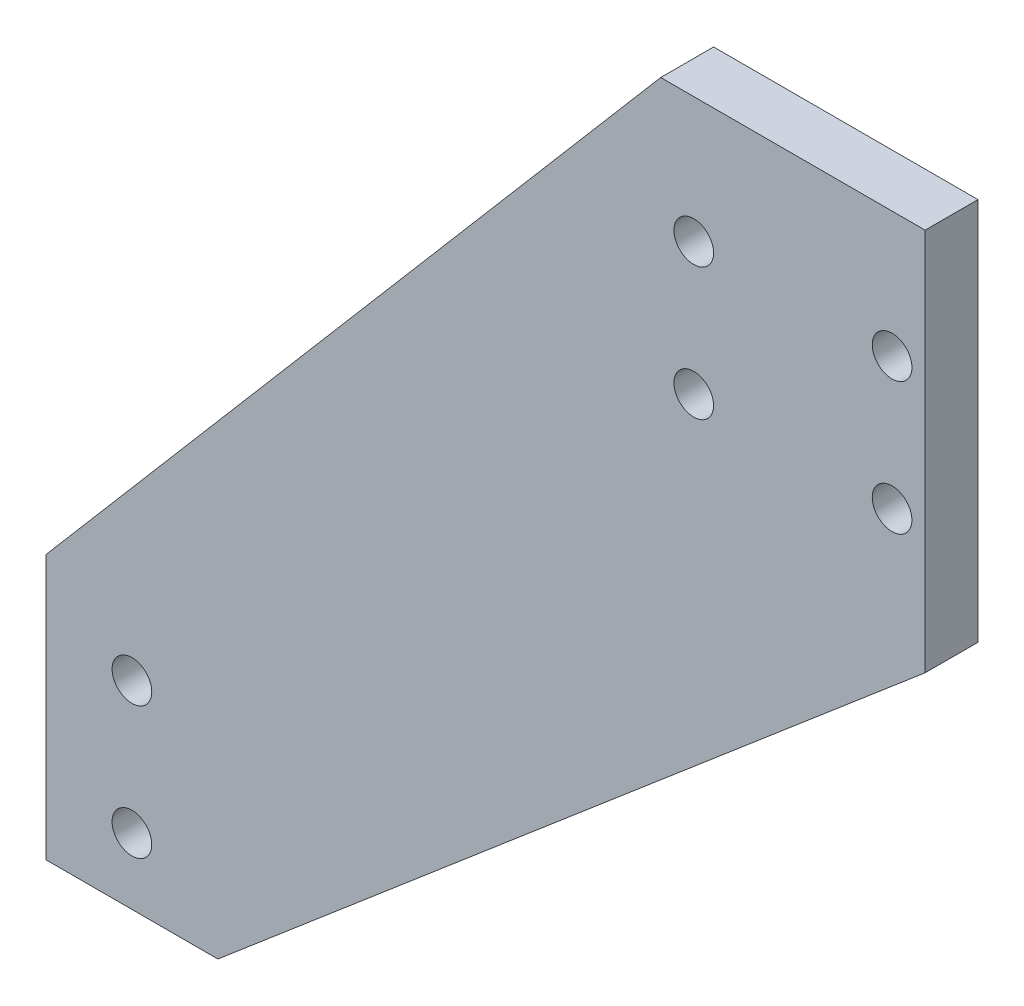
ISO-10303-21;
HEADER;
FILE_DESCRIPTION(('STEP AP214'),'2;1');
FILE_NAME('part.step','',(''),(''),'','','');
FILE_SCHEMA(('AUTOMOTIVE_DESIGN { 1 0 10303 214 1 1 1 1 }'));
ENDSEC;
DATA;
#1=APPLICATION_CONTEXT('core data for automotive mechanical design processes');
#2=APPLICATION_PROTOCOL_DEFINITION('international standard','automotive_design',2000,#1);
#3=PRODUCT_CONTEXT('',#1,'mechanical');
#4=PRODUCT('Part','Part','',(#3));
#5=PRODUCT_RELATED_PRODUCT_CATEGORY('part','',(#4));
#6=PRODUCT_DEFINITION_FORMATION('','',#4);
#7=PRODUCT_DEFINITION_CONTEXT('part definition',#1,'design');
#8=PRODUCT_DEFINITION('design','',#6,#7);
#9=PRODUCT_DEFINITION_SHAPE('','',#8);
#10=(LENGTH_UNIT() NAMED_UNIT(*) SI_UNIT(.MILLI.,.METRE.));
#11=(NAMED_UNIT(*) PLANE_ANGLE_UNIT() SI_UNIT($,.RADIAN.));
#12=(NAMED_UNIT(*) SI_UNIT($,.STERADIAN.) SOLID_ANGLE_UNIT());
#13=UNCERTAINTY_MEASURE_WITH_UNIT(LENGTH_MEASURE(1.E-05),#10,'distance_accuracy_value','');
#14=(GEOMETRIC_REPRESENTATION_CONTEXT(3) GLOBAL_UNCERTAINTY_ASSIGNED_CONTEXT((#13)) GLOBAL_UNIT_ASSIGNED_CONTEXT((#10,
#11,#12)) REPRESENTATION_CONTEXT('',''));
#15=CARTESIAN_POINT('',(0.,0.,0.));
#16=DIRECTION('',(0.,0.,1.));
#17=DIRECTION('',(1.,0.,0.));
#18=AXIS2_PLACEMENT_3D('',#15,#16,#17);
#19=CARTESIAN_POINT('',(0.,0.,4.));
#20=DIRECTION('',(0.,0.,1.));
#21=DIRECTION('',(1.,0.,0.));
#22=AXIS2_PLACEMENT_3D('',#19,#20,#21);
#23=PLANE('',#22);
#24=CARTESIAN_POINT('',(49.,65.,4.));
#25=DIRECTION('',(0.,0.,1.));
#26=DIRECTION('',(-1.,0.,0.));
#27=AXIS2_PLACEMENT_3D('',#24,#25,#26);
#28=CIRCLE('',#27,1.5);
#29=CARTESIAN_POINT('',(47.5,65.,4.));
#30=VERTEX_POINT('',#29);
#31=EDGE_CURVE('E228',#30,#30,#28,.T.);
#32=ORIENTED_EDGE('',*,*,#31,.F.);
#33=EDGE_LOOP('',(#32));
#34=FACE_BOUND('',#33,.T.);
#35=CARTESIAN_POINT('',(49.,55.,4.));
#36=DIRECTION('',(0.,0.,1.));
#37=DIRECTION('',(1.,0.,0.));
#38=AXIS2_PLACEMENT_3D('',#35,#36,#37);
#39=CIRCLE('',#38,1.5);
#40=CARTESIAN_POINT('',(50.5,55.,4.));
#41=VERTEX_POINT('',#40);
#42=EDGE_CURVE('E244',#41,#41,#39,.T.);
#43=ORIENTED_EDGE('',*,*,#42,.F.);
#44=EDGE_LOOP('',(#43));
#45=FACE_BOUND('',#44,.T.);
#46=CARTESIAN_POINT('',(6.5,15.,4.));
#47=DIRECTION('',(0.,0.,1.));
#48=DIRECTION('',(1.,0.,0.));
#49=AXIS2_PLACEMENT_3D('',#46,#47,#48);
#50=CIRCLE('',#49,1.5);
#51=CARTESIAN_POINT('',(8.,15.,4.));
#52=VERTEX_POINT('',#51);
#53=EDGE_CURVE('E142',#52,#52,#50,.T.);
#54=ORIENTED_EDGE('',*,*,#53,.F.);
#55=EDGE_LOOP('',(#54));
#56=FACE_BOUND('',#55,.T.);
#57=DIRECTION('',(0.,-1.,0.));
#58=VECTOR('',#57,1.);
#59=CARTESIAN_POINT('',(0.,20.,4.));
#60=LINE('',#59,#58);
#61=CARTESIAN_POINT('',(0.,20.,4.));
#62=VERTEX_POINT('',#61);
#63=CARTESIAN_POINT('',(0.,0.,4.));
#64=VERTEX_POINT('',#63);
#65=EDGE_CURVE('E152',#62,#64,#60,.T.);
#66=ORIENTED_EDGE('',*,*,#65,.T.);
#67=DIRECTION('',(1.,0.,0.));
#68=VECTOR('',#67,1.);
#69=CARTESIAN_POINT('',(0.,0.,4.));
#70=LINE('',#69,#68);
#71=CARTESIAN_POINT('',(13.,0.,4.));
#72=VERTEX_POINT('',#71);
#73=EDGE_CURVE('E99',#64,#72,#70,.T.);
#74=ORIENTED_EDGE('',*,*,#73,.T.);
#75=DIRECTION('',(0.761763632453225,0.647855051899472,0.));
#76=VECTOR('',#75,1.);
#77=CARTESIAN_POINT('',(13.,0.,4.));
#78=LINE('',#77,#76);
#79=CARTESIAN_POINT('',(66.5,45.5,4.));
#80=VERTEX_POINT('',#79);
#81=EDGE_CURVE('E114',#72,#80,#78,.T.);
#82=ORIENTED_EDGE('',*,*,#81,.T.);
#83=DIRECTION('',(0.,1.,0.));
#84=VECTOR('',#83,1.);
#85=CARTESIAN_POINT('',(66.5,45.5,4.));
#86=LINE('',#85,#84);
#87=CARTESIAN_POINT('',(66.5,74.5,4.));
#88=VERTEX_POINT('',#87);
#89=EDGE_CURVE('E110',#80,#88,#86,.T.);
#90=ORIENTED_EDGE('',*,*,#89,.T.);
#91=DIRECTION('',(-1.,0.,0.));
#92=VECTOR('',#91,1.);
#93=CARTESIAN_POINT('',(66.5,74.5,4.));
#94=LINE('',#93,#92);
#95=CARTESIAN_POINT('',(46.5,74.5,4.));
#96=VERTEX_POINT('',#95);
#97=EDGE_CURVE('E112',#88,#96,#94,.T.);
#98=ORIENTED_EDGE('',*,*,#97,.T.);
#99=DIRECTION('',(-0.64906542277297,-0.760732592282298,0.));
#100=VECTOR('',#99,1.);
#101=CARTESIAN_POINT('',(46.5,74.5,4.));
#102=LINE('',#101,#100);
#103=EDGE_CURVE('E62',#96,#62,#102,.T.);
#104=ORIENTED_EDGE('',*,*,#103,.T.);
#105=EDGE_LOOP('',(#66,#74,#82,#90,#98,#104));
#106=FACE_BOUND('',#105,.T.);
#107=CARTESIAN_POINT('',(6.5,5.,4.));
#108=DIRECTION('',(0.,0.,1.));
#109=DIRECTION('',(-1.,0.,0.));
#110=AXIS2_PLACEMENT_3D('',#107,#108,#109);
#111=CIRCLE('',#110,1.5);
#112=CARTESIAN_POINT('',(5.,5.,4.));
#113=VERTEX_POINT('',#112);
#114=EDGE_CURVE('E249',#113,#113,#111,.T.);
#115=ORIENTED_EDGE('',*,*,#114,.F.);
#116=EDGE_LOOP('',(#115));
#117=FACE_BOUND('',#116,.T.);
#118=CARTESIAN_POINT('',(64.,55.,4.));
#119=DIRECTION('',(0.,0.,1.));
#120=DIRECTION('',(-1.,0.,0.));
#121=AXIS2_PLACEMENT_3D('',#118,#119,#120);
#122=CIRCLE('',#121,1.5);
#123=CARTESIAN_POINT('',(62.5,55.,4.));
#124=VERTEX_POINT('',#123);
#125=EDGE_CURVE('E234',#124,#124,#122,.T.);
#126=ORIENTED_EDGE('',*,*,#125,.F.);
#127=EDGE_LOOP('',(#126));
#128=FACE_BOUND('',#127,.T.);
#129=CARTESIAN_POINT('',(64.,65.,4.));
#130=DIRECTION('',(0.,0.,1.));
#131=DIRECTION('',(1.,0.,0.));
#132=AXIS2_PLACEMENT_3D('',#129,#130,#131);
#133=CIRCLE('',#132,1.5);
#134=CARTESIAN_POINT('',(65.5,65.,4.));
#135=VERTEX_POINT('',#134);
#136=EDGE_CURVE('E212',#135,#135,#133,.T.);
#137=ORIENTED_EDGE('',*,*,#136,.F.);
#138=EDGE_LOOP('',(#137));
#139=FACE_BOUND('',#138,.T.);
#140=ADVANCED_FACE('F44',(#34,#45,#56,#106,#117,#128,#139),#23,.T.);
#141=CARTESIAN_POINT('',(0.,0.,0.));
#142=DIRECTION('',(0.,0.,1.));
#143=DIRECTION('',(1.,0.,0.));
#144=AXIS2_PLACEMENT_3D('',#141,#142,#143);
#145=PLANE('',#144);
#146=DIRECTION('',(0.,-1.,0.));
#147=VECTOR('',#146,1.);
#148=CARTESIAN_POINT('',(0.,20.,0.));
#149=LINE('',#148,#147);
#150=CARTESIAN_POINT('',(0.,20.,0.));
#151=VERTEX_POINT('',#150);
#152=CARTESIAN_POINT('',(0.,0.,0.));
#153=VERTEX_POINT('',#152);
#154=EDGE_CURVE('E140',#151,#153,#149,.T.);
#155=ORIENTED_EDGE('',*,*,#154,.F.);
#156=DIRECTION('',(-0.64906542277297,-0.760732592282298,0.));
#157=VECTOR('',#156,1.);
#158=CARTESIAN_POINT('',(46.5,74.5,0.));
#159=LINE('',#158,#157);
#160=CARTESIAN_POINT('',(46.5,74.5,0.));
#161=VERTEX_POINT('',#160);
#162=EDGE_CURVE('E95',#161,#151,#159,.T.);
#163=ORIENTED_EDGE('',*,*,#162,.F.);
#164=DIRECTION('',(-1.,0.,0.));
#165=VECTOR('',#164,1.);
#166=CARTESIAN_POINT('',(66.5,74.5,0.));
#167=LINE('',#166,#165);
#168=CARTESIAN_POINT('',(66.5,74.5,0.));
#169=VERTEX_POINT('',#168);
#170=EDGE_CURVE('E88',#169,#161,#167,.T.);
#171=ORIENTED_EDGE('',*,*,#170,.F.);
#172=DIRECTION('',(0.,1.,0.));
#173=VECTOR('',#172,1.);
#174=CARTESIAN_POINT('',(66.5,45.5,0.));
#175=LINE('',#174,#173);
#176=CARTESIAN_POINT('',(66.5,45.5,0.));
#177=VERTEX_POINT('',#176);
#178=EDGE_CURVE('E125',#177,#169,#175,.T.);
#179=ORIENTED_EDGE('',*,*,#178,.F.);
#180=DIRECTION('',(0.761763632453225,0.647855051899472,0.));
#181=VECTOR('',#180,1.);
#182=CARTESIAN_POINT('',(13.,0.,0.));
#183=LINE('',#182,#181);
#184=CARTESIAN_POINT('',(13.,0.,0.));
#185=VERTEX_POINT('',#184);
#186=EDGE_CURVE('E144',#185,#177,#183,.T.);
#187=ORIENTED_EDGE('',*,*,#186,.F.);
#188=DIRECTION('',(1.,0.,0.));
#189=VECTOR('',#188,1.);
#190=CARTESIAN_POINT('',(0.,0.,0.));
#191=LINE('',#190,#189);
#192=EDGE_CURVE('E143',#153,#185,#191,.T.);
#193=ORIENTED_EDGE('',*,*,#192,.F.);
#194=EDGE_LOOP('',(#155,#163,#171,#179,#187,#193));
#195=FACE_BOUND('',#194,.T.);
#196=CARTESIAN_POINT('',(6.5,15.,0.));
#197=DIRECTION('',(0.,0.,1.));
#198=DIRECTION('',(1.,0.,0.));
#199=AXIS2_PLACEMENT_3D('',#196,#197,#198);
#200=CIRCLE('',#199,1.5);
#201=CARTESIAN_POINT('',(8.,15.,0.));
#202=VERTEX_POINT('',#201);
#203=EDGE_CURVE('E252',#202,#202,#200,.T.);
#204=ORIENTED_EDGE('',*,*,#203,.T.);
#205=EDGE_LOOP('',(#204));
#206=FACE_BOUND('',#205,.T.);
#207=CARTESIAN_POINT('',(6.5,5.,0.));
#208=DIRECTION('',(0.,0.,1.));
#209=DIRECTION('',(-1.,0.,0.));
#210=AXIS2_PLACEMENT_3D('',#207,#208,#209);
#211=CIRCLE('',#210,1.5);
#212=CARTESIAN_POINT('',(5.,5.,0.));
#213=VERTEX_POINT('',#212);
#214=EDGE_CURVE('E241',#213,#213,#211,.T.);
#215=ORIENTED_EDGE('',*,*,#214,.T.);
#216=EDGE_LOOP('',(#215));
#217=FACE_BOUND('',#216,.T.);
#218=CARTESIAN_POINT('',(49.,55.,0.));
#219=DIRECTION('',(0.,0.,1.));
#220=DIRECTION('',(1.,0.,0.));
#221=AXIS2_PLACEMENT_3D('',#218,#219,#220);
#222=CIRCLE('',#221,1.5);
#223=CARTESIAN_POINT('',(50.5,55.,0.));
#224=VERTEX_POINT('',#223);
#225=EDGE_CURVE('E236',#224,#224,#222,.T.);
#226=ORIENTED_EDGE('',*,*,#225,.T.);
#227=EDGE_LOOP('',(#226));
#228=FACE_BOUND('',#227,.T.);
#229=CARTESIAN_POINT('',(64.,55.,0.));
#230=DIRECTION('',(0.,0.,1.));
#231=DIRECTION('',(-1.,0.,0.));
#232=AXIS2_PLACEMENT_3D('',#229,#230,#231);
#233=CIRCLE('',#232,1.5);
#234=CARTESIAN_POINT('',(62.5,55.,0.));
#235=VERTEX_POINT('',#234);
#236=EDGE_CURVE('E226',#235,#235,#233,.T.);
#237=ORIENTED_EDGE('',*,*,#236,.T.);
#238=EDGE_LOOP('',(#237));
#239=FACE_BOUND('',#238,.T.);
#240=CARTESIAN_POINT('',(49.,65.,0.));
#241=DIRECTION('',(0.,0.,1.));
#242=DIRECTION('',(-1.,0.,0.));
#243=AXIS2_PLACEMENT_3D('',#240,#241,#242);
#244=CIRCLE('',#243,1.5);
#245=CARTESIAN_POINT('',(47.5,65.,0.));
#246=VERTEX_POINT('',#245);
#247=EDGE_CURVE('E224',#246,#246,#244,.T.);
#248=ORIENTED_EDGE('',*,*,#247,.T.);
#249=EDGE_LOOP('',(#248));
#250=FACE_BOUND('',#249,.T.);
#251=CARTESIAN_POINT('',(64.,65.,0.));
#252=DIRECTION('',(0.,0.,1.));
#253=DIRECTION('',(1.,0.,0.));
#254=AXIS2_PLACEMENT_3D('',#251,#252,#253);
#255=CIRCLE('',#254,1.5);
#256=CARTESIAN_POINT('',(65.5,65.,0.));
#257=VERTEX_POINT('',#256);
#258=EDGE_CURVE('E220',#257,#257,#255,.T.);
#259=ORIENTED_EDGE('',*,*,#258,.T.);
#260=EDGE_LOOP('',(#259));
#261=FACE_BOUND('',#260,.T.);
#262=ADVANCED_FACE('F170',(#195,#206,#217,#228,#239,#250,#261),#145,.F.);
#263=CARTESIAN_POINT('',(0.,20.,4.));
#264=DIRECTION('',(1.,0.,0.));
#265=DIRECTION('',(0.,0.,-1.));
#266=AXIS2_PLACEMENT_3D('',#263,#264,#265);
#267=PLANE('',#266);
#268=ORIENTED_EDGE('',*,*,#154,.T.);
#269=DIRECTION('',(0.,0.,-1.));
#270=VECTOR('',#269,1.);
#271=CARTESIAN_POINT('',(0.,0.,4.));
#272=LINE('',#271,#270);
#273=EDGE_CURVE('E11',#64,#153,#272,.T.);
#274=ORIENTED_EDGE('',*,*,#273,.F.);
#275=ORIENTED_EDGE('',*,*,#65,.F.);
#276=DIRECTION('',(0.,0.,-1.));
#277=VECTOR('',#276,1.);
#278=CARTESIAN_POINT('',(0.,20.,4.));
#279=LINE('',#278,#277);
#280=EDGE_CURVE('E132',#62,#151,#279,.T.);
#281=ORIENTED_EDGE('',*,*,#280,.T.);
#282=EDGE_LOOP('',(#268,#274,#275,#281));
#283=FACE_BOUND('',#282,.T.);
#284=ADVANCED_FACE('F50',(#283),#267,.F.);
#285=CARTESIAN_POINT('',(0.,0.,4.));
#286=DIRECTION('',(0.,1.,0.));
#287=DIRECTION('',(0.,0.,1.));
#288=AXIS2_PLACEMENT_3D('',#285,#286,#287);
#289=PLANE('',#288);
#290=ORIENTED_EDGE('',*,*,#192,.T.);
#291=DIRECTION('',(0.,0.,-1.));
#292=VECTOR('',#291,1.);
#293=CARTESIAN_POINT('',(13.,0.,4.));
#294=LINE('',#293,#292);
#295=EDGE_CURVE('E54',#72,#185,#294,.T.);
#296=ORIENTED_EDGE('',*,*,#295,.F.);
#297=ORIENTED_EDGE('',*,*,#73,.F.);
#298=ORIENTED_EDGE('',*,*,#273,.T.);
#299=EDGE_LOOP('',(#290,#296,#297,#298));
#300=FACE_BOUND('',#299,.T.);
#301=ADVANCED_FACE('F329',(#300),#289,.F.);
#302=CARTESIAN_POINT('',(13.,0.,4.));
#303=DIRECTION('',(-0.647855051899472,0.761763632453225,0.));
#304=DIRECTION('',(-0.761763632453225,-0.647855051899472,0.));
#305=AXIS2_PLACEMENT_3D('',#302,#303,#304);
#306=PLANE('',#305);
#307=ORIENTED_EDGE('',*,*,#186,.T.);
#308=DIRECTION('',(0.,0.,-1.));
#309=VECTOR('',#308,1.);
#310=CARTESIAN_POINT('',(66.5,45.5,4.));
#311=LINE('',#310,#309);
#312=EDGE_CURVE('E124',#80,#177,#311,.T.);
#313=ORIENTED_EDGE('',*,*,#312,.F.);
#314=ORIENTED_EDGE('',*,*,#81,.F.);
#315=ORIENTED_EDGE('',*,*,#295,.T.);
#316=EDGE_LOOP('',(#307,#313,#314,#315));
#317=FACE_BOUND('',#316,.T.);
#318=ADVANCED_FACE('F163',(#317),#306,.F.);
#319=CARTESIAN_POINT('',(66.5,45.5,4.));
#320=DIRECTION('',(-1.,0.,0.));
#321=DIRECTION('',(0.,-1.,0.));
#322=AXIS2_PLACEMENT_3D('',#319,#320,#321);
#323=PLANE('',#322);
#324=ORIENTED_EDGE('',*,*,#178,.T.);
#325=DIRECTION('',(0.,0.,-1.));
#326=VECTOR('',#325,1.);
#327=CARTESIAN_POINT('',(66.5,74.5,4.));
#328=LINE('',#327,#326);
#329=EDGE_CURVE('E120',#88,#169,#328,.T.);
#330=ORIENTED_EDGE('',*,*,#329,.F.);
#331=ORIENTED_EDGE('',*,*,#89,.F.);
#332=ORIENTED_EDGE('',*,*,#312,.T.);
#333=EDGE_LOOP('',(#324,#330,#331,#332));
#334=FACE_BOUND('',#333,.T.);
#335=ADVANCED_FACE('F116',(#334),#323,.F.);
#336=CARTESIAN_POINT('',(66.5,74.5,4.));
#337=DIRECTION('',(0.,-1.,0.));
#338=DIRECTION('',(0.,0.,-1.));
#339=AXIS2_PLACEMENT_3D('',#336,#337,#338);
#340=PLANE('',#339);
#341=ORIENTED_EDGE('',*,*,#170,.T.);
#342=DIRECTION('',(0.,0.,-1.));
#343=VECTOR('',#342,1.);
#344=CARTESIAN_POINT('',(46.5,74.5,4.));
#345=LINE('',#344,#343);
#346=EDGE_CURVE('E121',#96,#161,#345,.T.);
#347=ORIENTED_EDGE('',*,*,#346,.F.);
#348=ORIENTED_EDGE('',*,*,#97,.F.);
#349=ORIENTED_EDGE('',*,*,#329,.T.);
#350=EDGE_LOOP('',(#341,#347,#348,#349));
#351=FACE_BOUND('',#350,.T.);
#352=ADVANCED_FACE('F130',(#351),#340,.F.);
#353=CARTESIAN_POINT('',(46.5,74.5,4.));
#354=DIRECTION('',(0.760732592282298,-0.64906542277297,0.));
#355=DIRECTION('',(0.64906542277297,0.760732592282298,0.));
#356=AXIS2_PLACEMENT_3D('',#353,#354,#355);
#357=PLANE('',#356);
#358=ORIENTED_EDGE('',*,*,#162,.T.);
#359=ORIENTED_EDGE('',*,*,#280,.F.);
#360=ORIENTED_EDGE('',*,*,#103,.F.);
#361=ORIENTED_EDGE('',*,*,#346,.T.);
#362=EDGE_LOOP('',(#358,#359,#360,#361));
#363=FACE_BOUND('',#362,.T.);
#364=ADVANCED_FACE('F174',(#363),#357,.F.);
#365=CARTESIAN_POINT('',(6.5,15.,4.));
#366=DIRECTION('',(0.,0.,-1.));
#367=DIRECTION('',(-1.,0.,0.));
#368=AXIS2_PLACEMENT_3D('',#365,#366,#367);
#369=CYLINDRICAL_SURFACE('',#368,1.5);
#370=ORIENTED_EDGE('',*,*,#53,.T.);
#371=EDGE_LOOP('',(#370));
#372=FACE_BOUND('',#371,.T.);
#373=ORIENTED_EDGE('',*,*,#203,.F.);
#374=EDGE_LOOP('',(#373));
#375=FACE_BOUND('',#374,.T.);
#376=ADVANCED_FACE('F175',(#372,#375),#369,.F.);
#377=CARTESIAN_POINT('',(6.5,5.,4.));
#378=DIRECTION('',(0.,0.,-1.));
#379=DIRECTION('',(-1.,0.,0.));
#380=AXIS2_PLACEMENT_3D('',#377,#378,#379);
#381=CYLINDRICAL_SURFACE('',#380,1.5);
#382=ORIENTED_EDGE('',*,*,#114,.T.);
#383=EDGE_LOOP('',(#382));
#384=FACE_BOUND('',#383,.T.);
#385=ORIENTED_EDGE('',*,*,#214,.F.);
#386=EDGE_LOOP('',(#385));
#387=FACE_BOUND('',#386,.T.);
#388=ADVANCED_FACE('F179',(#384,#387),#381,.F.);
#389=CARTESIAN_POINT('',(49.,55.,4.));
#390=DIRECTION('',(0.,0.,-1.));
#391=DIRECTION('',(-1.,0.,0.));
#392=AXIS2_PLACEMENT_3D('',#389,#390,#391);
#393=CYLINDRICAL_SURFACE('',#392,1.5);
#394=ORIENTED_EDGE('',*,*,#42,.T.);
#395=EDGE_LOOP('',(#394));
#396=FACE_BOUND('',#395,.T.);
#397=ORIENTED_EDGE('',*,*,#225,.F.);
#398=EDGE_LOOP('',(#397));
#399=FACE_BOUND('',#398,.T.);
#400=ADVANCED_FACE('F194',(#396,#399),#393,.F.);
#401=CARTESIAN_POINT('',(64.,55.,4.));
#402=DIRECTION('',(0.,0.,-1.));
#403=DIRECTION('',(-1.,0.,0.));
#404=AXIS2_PLACEMENT_3D('',#401,#402,#403);
#405=CYLINDRICAL_SURFACE('',#404,1.5);
#406=ORIENTED_EDGE('',*,*,#125,.T.);
#407=EDGE_LOOP('',(#406));
#408=FACE_BOUND('',#407,.T.);
#409=ORIENTED_EDGE('',*,*,#236,.F.);
#410=EDGE_LOOP('',(#409));
#411=FACE_BOUND('',#410,.T.);
#412=ADVANCED_FACE('F196',(#408,#411),#405,.F.);
#413=CARTESIAN_POINT('',(49.,65.,4.));
#414=DIRECTION('',(0.,0.,-1.));
#415=DIRECTION('',(-1.,0.,0.));
#416=AXIS2_PLACEMENT_3D('',#413,#414,#415);
#417=CYLINDRICAL_SURFACE('',#416,1.5);
#418=ORIENTED_EDGE('',*,*,#31,.T.);
#419=EDGE_LOOP('',(#418));
#420=FACE_BOUND('',#419,.T.);
#421=ORIENTED_EDGE('',*,*,#247,.F.);
#422=EDGE_LOOP('',(#421));
#423=FACE_BOUND('',#422,.T.);
#424=ADVANCED_FACE('F205',(#420,#423),#417,.F.);
#425=CARTESIAN_POINT('',(64.,65.,4.));
#426=DIRECTION('',(0.,0.,-1.));
#427=DIRECTION('',(-1.,0.,0.));
#428=AXIS2_PLACEMENT_3D('',#425,#426,#427);
#429=CYLINDRICAL_SURFACE('',#428,1.5);
#430=ORIENTED_EDGE('',*,*,#136,.T.);
#431=EDGE_LOOP('',(#430));
#432=FACE_BOUND('',#431,.T.);
#433=ORIENTED_EDGE('',*,*,#258,.F.);
#434=EDGE_LOOP('',(#433));
#435=FACE_BOUND('',#434,.T.);
#436=ADVANCED_FACE('F206',(#432,#435),#429,.F.);
#437=CLOSED_SHELL('',(#140,#262,#284,#301,#318,#335,#352,#364,#376,#388,#400,#412,#424,#436));
#438=MANIFOLD_SOLID_BREP('B2',#437);
#439=ADVANCED_BREP_SHAPE_REPRESENTATION('',(#18,#438),#14);
#440=SHAPE_DEFINITION_REPRESENTATION(#9,#439);
ENDSEC;
END-ISO-10303-21;
